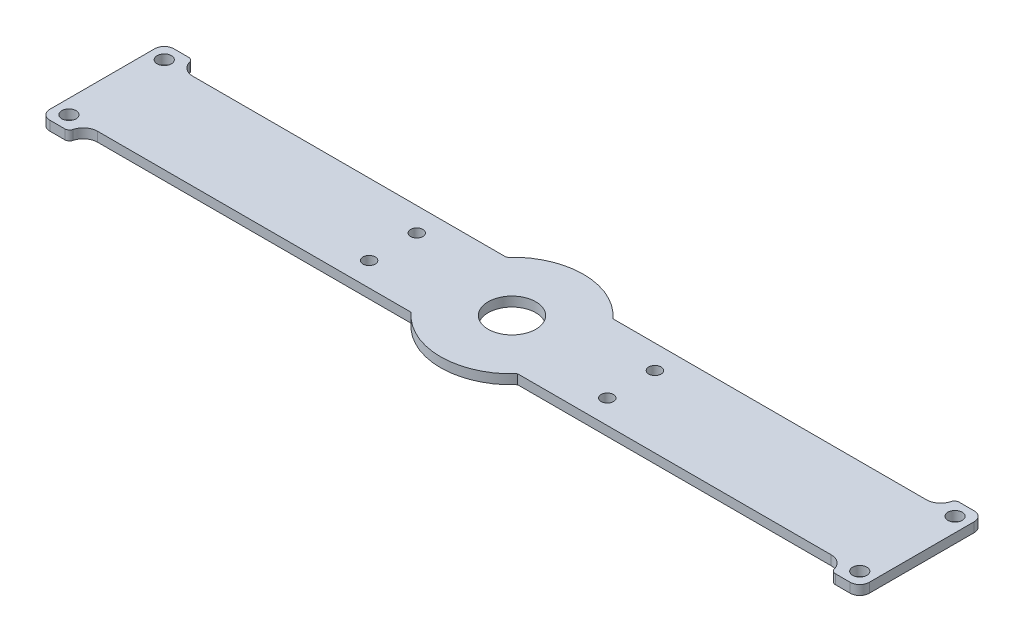
ISO-10303-21;
HEADER;
FILE_DESCRIPTION(('STEP AP214'),'2;1');
FILE_NAME('part.step','',(''),(''),'','','');
FILE_SCHEMA(('AUTOMOTIVE_DESIGN { 1 0 10303 214 1 1 1 1 }'));
ENDSEC;
DATA;
#1=APPLICATION_CONTEXT('core data for automotive mechanical design processes');
#2=APPLICATION_PROTOCOL_DEFINITION('international standard','automotive_design',2000,#1);
#3=PRODUCT_CONTEXT('',#1,'mechanical');
#4=PRODUCT('Part','Part','',(#3));
#5=PRODUCT_RELATED_PRODUCT_CATEGORY('part','',(#4));
#6=PRODUCT_DEFINITION_FORMATION('','',#4);
#7=PRODUCT_DEFINITION_CONTEXT('part definition',#1,'design');
#8=PRODUCT_DEFINITION('design','',#6,#7);
#9=PRODUCT_DEFINITION_SHAPE('','',#8);
#10=(LENGTH_UNIT() NAMED_UNIT(*) SI_UNIT(.MILLI.,.METRE.));
#11=(NAMED_UNIT(*) PLANE_ANGLE_UNIT() SI_UNIT($,.RADIAN.));
#12=(NAMED_UNIT(*) SI_UNIT($,.STERADIAN.) SOLID_ANGLE_UNIT());
#13=UNCERTAINTY_MEASURE_WITH_UNIT(LENGTH_MEASURE(1.E-05),#10,'distance_accuracy_value','');
#14=(GEOMETRIC_REPRESENTATION_CONTEXT(3) GLOBAL_UNCERTAINTY_ASSIGNED_CONTEXT((#13)) GLOBAL_UNIT_ASSIGNED_CONTEXT((#10,
#11,#12)) REPRESENTATION_CONTEXT('',''));
#15=CARTESIAN_POINT('',(0.,0.,0.));
#16=DIRECTION('',(0.,0.,1.));
#17=DIRECTION('',(1.,0.,0.));
#18=AXIS2_PLACEMENT_3D('',#15,#16,#17);
#19=CARTESIAN_POINT('',(0.,2.,0.));
#20=DIRECTION('',(0.,1.,0.));
#21=DIRECTION('',(0.,0.,1.));
#22=AXIS2_PLACEMENT_3D('',#19,#20,#21);
#23=PLANE('',#22);
#24=CARTESIAN_POINT('',(25.,2.,-5.));
#25=DIRECTION('',(0.,1.,0.));
#26=DIRECTION('',(0.,0.,-1.));
#27=AXIS2_PLACEMENT_3D('',#24,#25,#26);
#28=CIRCLE('',#27,1.3);
#29=CARTESIAN_POINT('',(25.,2.,-6.3));
#30=VERTEX_POINT('',#29);
#31=EDGE_CURVE('E460',#30,#30,#28,.T.);
#32=ORIENTED_EDGE('',*,*,#31,.F.);
#33=EDGE_LOOP('',(#32));
#34=FACE_BOUND('',#33,.T.);
#35=CARTESIAN_POINT('',(25.,2.,5.));
#36=DIRECTION('',(0.,1.,0.));
#37=DIRECTION('',(0.,0.,1.));
#38=AXIS2_PLACEMENT_3D('',#35,#36,#37);
#39=CIRCLE('',#38,1.3);
#40=CARTESIAN_POINT('',(25.,2.,6.29999999999999));
#41=VERTEX_POINT('',#40);
#42=EDGE_CURVE('E452',#41,#41,#39,.T.);
#43=ORIENTED_EDGE('',*,*,#42,.F.);
#44=EDGE_LOOP('',(#43));
#45=FACE_BOUND('',#44,.T.);
#46=CARTESIAN_POINT('',(-25.,2.,5.));
#47=DIRECTION('',(0.,1.,0.));
#48=DIRECTION('',(0.,0.,-1.));
#49=AXIS2_PLACEMENT_3D('',#46,#47,#48);
#50=CIRCLE('',#49,1.3);
#51=CARTESIAN_POINT('',(-25.,2.,3.7));
#52=VERTEX_POINT('',#51);
#53=EDGE_CURVE('E444',#52,#52,#50,.T.);
#54=ORIENTED_EDGE('',*,*,#53,.F.);
#55=EDGE_LOOP('',(#54));
#56=FACE_BOUND('',#55,.T.);
#57=CARTESIAN_POINT('',(-25.,2.,-5.));
#58=DIRECTION('',(0.,1.,0.));
#59=DIRECTION('',(0.,0.,1.));
#60=AXIS2_PLACEMENT_3D('',#57,#58,#59);
#61=CIRCLE('',#60,1.3);
#62=CARTESIAN_POINT('',(-25.,2.,-3.7));
#63=VERTEX_POINT('',#62);
#64=EDGE_CURVE('E443',#63,#63,#61,.T.);
#65=ORIENTED_EDGE('',*,*,#64,.F.);
#66=EDGE_LOOP('',(#65));
#67=FACE_BOUND('',#66,.T.);
#68=CARTESIAN_POINT('',(77.,2.,13.));
#69=DIRECTION('',(0.,1.,0.));
#70=DIRECTION('',(0.,0.,1.));
#71=AXIS2_PLACEMENT_3D('',#68,#69,#70);
#72=CIRCLE('',#71,3.);
#73=CARTESIAN_POINT('',(77.,2.,10.));
#74=VERTEX_POINT('',#73);
#75=CARTESIAN_POINT('',(79.9047375096555,2.,12.25));
#76=VERTEX_POINT('',#75);
#77=EDGE_CURVE('E287',#74,#76,#72,.F.);
#78=ORIENTED_EDGE('',*,*,#77,.T.);
#79=CARTESIAN_POINT('',(80.8729833462074,2.,12.));
#80=DIRECTION('',(0.,1.,0.));
#81=DIRECTION('',(0.,0.,1.));
#82=AXIS2_PLACEMENT_3D('',#79,#80,#81);
#83=CIRCLE('',#82,1.);
#84=CARTESIAN_POINT('',(80.8729833462074,2.,13.));
#85=VERTEX_POINT('',#84);
#86=EDGE_CURVE('E392',#76,#85,#83,.T.);
#87=ORIENTED_EDGE('',*,*,#86,.T.);
#88=DIRECTION('',(1.,0.,0.));
#89=VECTOR('',#88,1.);
#90=CARTESIAN_POINT('',(80.,2.,13.));
#91=LINE('',#90,#89);
#92=CARTESIAN_POINT('',(84.,2.,13.));
#93=VERTEX_POINT('',#92);
#94=EDGE_CURVE('E495',#85,#93,#91,.T.);
#95=ORIENTED_EDGE('',*,*,#94,.T.);
#96=CARTESIAN_POINT('',(84.,2.,11.));
#97=DIRECTION('',(0.,1.,0.));
#98=DIRECTION('',(0.,0.,1.));
#99=AXIS2_PLACEMENT_3D('',#96,#97,#98);
#100=CIRCLE('',#99,2.);
#101=CARTESIAN_POINT('',(86.,2.,11.));
#102=VERTEX_POINT('',#101);
#103=EDGE_CURVE('E337',#93,#102,#100,.T.);
#104=ORIENTED_EDGE('',*,*,#103,.T.);
#105=DIRECTION('',(0.,0.,-1.));
#106=VECTOR('',#105,1.);
#107=CARTESIAN_POINT('',(86.,2.,-13.));
#108=LINE('',#107,#106);
#109=CARTESIAN_POINT('',(86.,2.,-11.));
#110=VERTEX_POINT('',#109);
#111=EDGE_CURVE('E501',#102,#110,#108,.T.);
#112=ORIENTED_EDGE('',*,*,#111,.T.);
#113=CARTESIAN_POINT('',(84.,2.,-11.));
#114=DIRECTION('',(0.,1.,0.));
#115=DIRECTION('',(0.,0.,1.));
#116=AXIS2_PLACEMENT_3D('',#113,#114,#115);
#117=CIRCLE('',#116,2.);
#118=CARTESIAN_POINT('',(84.,2.,-13.));
#119=VERTEX_POINT('',#118);
#120=EDGE_CURVE('E334',#110,#119,#117,.T.);
#121=ORIENTED_EDGE('',*,*,#120,.T.);
#122=DIRECTION('',(-1.,0.,0.));
#123=VECTOR('',#122,1.);
#124=CARTESIAN_POINT('',(80.,2.,-13.));
#125=LINE('',#124,#123);
#126=CARTESIAN_POINT('',(80.8729833462074,2.,-13.));
#127=VERTEX_POINT('',#126);
#128=EDGE_CURVE('E507',#119,#127,#125,.T.);
#129=ORIENTED_EDGE('',*,*,#128,.T.);
#130=CARTESIAN_POINT('',(80.8729833462074,2.,-12.));
#131=DIRECTION('',(0.,1.,0.));
#132=DIRECTION('',(0.,0.,1.));
#133=AXIS2_PLACEMENT_3D('',#130,#131,#132);
#134=CIRCLE('',#133,1.);
#135=CARTESIAN_POINT('',(79.9047375096555,2.,-12.25));
#136=VERTEX_POINT('',#135);
#137=EDGE_CURVE('E61',#127,#136,#134,.T.);
#138=ORIENTED_EDGE('',*,*,#137,.T.);
#139=CARTESIAN_POINT('',(77.,2.,-13.));
#140=DIRECTION('',(0.,1.,0.));
#141=DIRECTION('',(0.,0.,1.));
#142=AXIS2_PLACEMENT_3D('',#139,#140,#141);
#143=CIRCLE('',#142,3.);
#144=CARTESIAN_POINT('',(77.,2.,-10.));
#145=VERTEX_POINT('',#144);
#146=EDGE_CURVE('E208',#136,#145,#143,.F.);
#147=ORIENTED_EDGE('',*,*,#146,.T.);
#148=DIRECTION('',(-1.,0.,0.));
#149=VECTOR('',#148,1.);
#150=CARTESIAN_POINT('',(11.1803398874989,2.,-10.));
#151=LINE('',#150,#149);
#152=CARTESIAN_POINT('',(11.1803398874989,2.,-10.));
#153=VERTEX_POINT('',#152);
#154=EDGE_CURVE('E200',#145,#153,#151,.T.);
#155=ORIENTED_EDGE('',*,*,#154,.T.);
#156=CARTESIAN_POINT('',(0.,2.,0.));
#157=DIRECTION('',(0.,1.,0.));
#158=DIRECTION('',(0.,0.,1.));
#159=AXIS2_PLACEMENT_3D('',#156,#157,#158);
#160=CIRCLE('',#159,15.);
#161=CARTESIAN_POINT('',(-11.180339887499,2.,-9.99999999999999));
#162=VERTEX_POINT('',#161);
#163=EDGE_CURVE('E206',#153,#162,#160,.T.);
#164=ORIENTED_EDGE('',*,*,#163,.T.);
#165=DIRECTION('',(-1.,0.,0.));
#166=VECTOR('',#165,1.);
#167=CARTESIAN_POINT('',(-80.,2.,-10.));
#168=LINE('',#167,#166);
#169=CARTESIAN_POINT('',(-77.,2.,-10.));
#170=VERTEX_POINT('',#169);
#171=EDGE_CURVE('E230',#162,#170,#168,.T.);
#172=ORIENTED_EDGE('',*,*,#171,.T.);
#173=CARTESIAN_POINT('',(-77.,2.,-13.));
#174=DIRECTION('',(0.,1.,0.));
#175=DIRECTION('',(0.,0.,1.));
#176=AXIS2_PLACEMENT_3D('',#173,#174,#175);
#177=CIRCLE('',#176,3.);
#178=CARTESIAN_POINT('',(-79.9047375096555,2.,-12.25));
#179=VERTEX_POINT('',#178);
#180=EDGE_CURVE('E299',#170,#179,#177,.F.);
#181=ORIENTED_EDGE('',*,*,#180,.T.);
#182=CARTESIAN_POINT('',(-80.8729833462074,2.,-12.));
#183=DIRECTION('',(0.,1.,0.));
#184=DIRECTION('',(0.,0.,1.));
#185=AXIS2_PLACEMENT_3D('',#182,#183,#184);
#186=CIRCLE('',#185,1.);
#187=CARTESIAN_POINT('',(-80.8729833462074,2.,-13.));
#188=VERTEX_POINT('',#187);
#189=EDGE_CURVE('E384',#179,#188,#186,.T.);
#190=ORIENTED_EDGE('',*,*,#189,.T.);
#191=DIRECTION('',(-1.,0.,0.));
#192=VECTOR('',#191,1.);
#193=CARTESIAN_POINT('',(-80.,2.,-13.));
#194=LINE('',#193,#192);
#195=CARTESIAN_POINT('',(-84.,2.,-13.));
#196=VERTEX_POINT('',#195);
#197=EDGE_CURVE('E416',#188,#196,#194,.T.);
#198=ORIENTED_EDGE('',*,*,#197,.T.);
#199=CARTESIAN_POINT('',(-84.,2.,-11.));
#200=DIRECTION('',(0.,1.,0.));
#201=DIRECTION('',(0.,0.,1.));
#202=AXIS2_PLACEMENT_3D('',#199,#200,#201);
#203=CIRCLE('',#202,2.);
#204=CARTESIAN_POINT('',(-86.,2.,-11.));
#205=VERTEX_POINT('',#204);
#206=EDGE_CURVE('E343',#196,#205,#203,.T.);
#207=ORIENTED_EDGE('',*,*,#206,.T.);
#208=DIRECTION('',(0.,0.,1.));
#209=VECTOR('',#208,1.);
#210=CARTESIAN_POINT('',(-86.,2.,-13.));
#211=LINE('',#210,#209);
#212=CARTESIAN_POINT('',(-86.,2.,11.));
#213=VERTEX_POINT('',#212);
#214=EDGE_CURVE('E464',#205,#213,#211,.T.);
#215=ORIENTED_EDGE('',*,*,#214,.T.);
#216=CARTESIAN_POINT('',(-84.,2.,11.));
#217=DIRECTION('',(0.,1.,0.));
#218=DIRECTION('',(0.,0.,1.));
#219=AXIS2_PLACEMENT_3D('',#216,#217,#218);
#220=CIRCLE('',#219,2.);
#221=CARTESIAN_POINT('',(-84.,2.,13.));
#222=VERTEX_POINT('',#221);
#223=EDGE_CURVE('E340',#213,#222,#220,.T.);
#224=ORIENTED_EDGE('',*,*,#223,.T.);
#225=DIRECTION('',(1.,0.,0.));
#226=VECTOR('',#225,1.);
#227=CARTESIAN_POINT('',(-80.,2.,13.));
#228=LINE('',#227,#226);
#229=CARTESIAN_POINT('',(-80.8729833462074,2.,13.));
#230=VERTEX_POINT('',#229);
#231=EDGE_CURVE('E432',#222,#230,#228,.T.);
#232=ORIENTED_EDGE('',*,*,#231,.T.);
#233=CARTESIAN_POINT('',(-80.8729833462074,2.,12.));
#234=DIRECTION('',(0.,1.,0.));
#235=DIRECTION('',(0.,0.,1.));
#236=AXIS2_PLACEMENT_3D('',#233,#234,#235);
#237=CIRCLE('',#236,1.);
#238=CARTESIAN_POINT('',(-79.9047375096555,2.,12.25));
#239=VERTEX_POINT('',#238);
#240=EDGE_CURVE('E387',#230,#239,#237,.T.);
#241=ORIENTED_EDGE('',*,*,#240,.T.);
#242=CARTESIAN_POINT('',(-77.,2.,13.));
#243=DIRECTION('',(0.,1.,0.));
#244=DIRECTION('',(0.,0.,1.));
#245=AXIS2_PLACEMENT_3D('',#242,#243,#244);
#246=CIRCLE('',#245,3.);
#247=CARTESIAN_POINT('',(-77.,2.,10.));
#248=VERTEX_POINT('',#247);
#249=EDGE_CURVE('E306',#239,#248,#246,.F.);
#250=ORIENTED_EDGE('',*,*,#249,.T.);
#251=DIRECTION('',(1.,0.,0.));
#252=VECTOR('',#251,1.);
#253=CARTESIAN_POINT('',(-80.,2.,10.));
#254=LINE('',#253,#252);
#255=CARTESIAN_POINT('',(-11.1803398874989,2.,10.));
#256=VERTEX_POINT('',#255);
#257=EDGE_CURVE('E233',#248,#256,#254,.T.);
#258=ORIENTED_EDGE('',*,*,#257,.T.);
#259=CARTESIAN_POINT('',(0.,2.,0.));
#260=DIRECTION('',(0.,1.,0.));
#261=DIRECTION('',(0.,0.,1.));
#262=AXIS2_PLACEMENT_3D('',#259,#260,#261);
#263=CIRCLE('',#262,15.);
#264=CARTESIAN_POINT('',(11.1803398874989,2.,10.));
#265=VERTEX_POINT('',#264);
#266=EDGE_CURVE('E239',#256,#265,#263,.T.);
#267=ORIENTED_EDGE('',*,*,#266,.T.);
#268=DIRECTION('',(1.,0.,0.));
#269=VECTOR('',#268,1.);
#270=CARTESIAN_POINT('',(11.1803398874989,2.,10.));
#271=LINE('',#270,#269);
#272=EDGE_CURVE('E213',#265,#74,#271,.T.);
#273=ORIENTED_EDGE('',*,*,#272,.T.);
#274=EDGE_LOOP('',(#78,#87,#95,#104,#112,#121,#129,#138,#147,#155,#164,#172,#181,#190,#198,#207,
#215,#224,#232,#241,#250,#258,#267,#273));
#275=FACE_BOUND('',#274,.T.);
#276=CARTESIAN_POINT('',(0.,2.,0.));
#277=DIRECTION('',(0.,1.,0.));
#278=DIRECTION('',(0.,0.,1.));
#279=AXIS2_PLACEMENT_3D('',#276,#277,#278);
#280=CIRCLE('',#279,5.);
#281=CARTESIAN_POINT('',(0.,2.,5.));
#282=VERTEX_POINT('',#281);
#283=EDGE_CURVE('E247',#282,#282,#280,.T.);
#284=ORIENTED_EDGE('',*,*,#283,.F.);
#285=EDGE_LOOP('',(#284));
#286=FACE_BOUND('',#285,.T.);
#287=CARTESIAN_POINT('',(-83.,2.,-10.));
#288=DIRECTION('',(0.,1.,0.));
#289=DIRECTION('',(0.,0.,1.));
#290=AXIS2_PLACEMENT_3D('',#287,#288,#289);
#291=CIRCLE('',#290,1.5);
#292=CARTESIAN_POINT('',(-83.,2.,-8.5));
#293=VERTEX_POINT('',#292);
#294=EDGE_CURVE('E435',#293,#293,#291,.T.);
#295=ORIENTED_EDGE('',*,*,#294,.F.);
#296=EDGE_LOOP('',(#295));
#297=FACE_BOUND('',#296,.T.);
#298=CARTESIAN_POINT('',(-83.,2.,10.));
#299=DIRECTION('',(0.,1.,0.));
#300=DIRECTION('',(0.,0.,-1.));
#301=AXIS2_PLACEMENT_3D('',#298,#299,#300);
#302=CIRCLE('',#301,1.5);
#303=CARTESIAN_POINT('',(-83.,2.,8.5));
#304=VERTEX_POINT('',#303);
#305=EDGE_CURVE('E526',#304,#304,#302,.T.);
#306=ORIENTED_EDGE('',*,*,#305,.F.);
#307=EDGE_LOOP('',(#306));
#308=FACE_BOUND('',#307,.T.);
#309=CARTESIAN_POINT('',(83.,2.,10.));
#310=DIRECTION('',(0.,1.,0.));
#311=DIRECTION('',(0.,0.,1.));
#312=AXIS2_PLACEMENT_3D('',#309,#310,#311);
#313=CIRCLE('',#312,1.5);
#314=CARTESIAN_POINT('',(83.,2.,11.5));
#315=VERTEX_POINT('',#314);
#316=EDGE_CURVE('E522',#315,#315,#313,.T.);
#317=ORIENTED_EDGE('',*,*,#316,.F.);
#318=EDGE_LOOP('',(#317));
#319=FACE_BOUND('',#318,.T.);
#320=CARTESIAN_POINT('',(83.,2.,-10.));
#321=DIRECTION('',(0.,1.,0.));
#322=DIRECTION('',(0.,0.,-1.));
#323=AXIS2_PLACEMENT_3D('',#320,#321,#322);
#324=CIRCLE('',#323,1.5);
#325=CARTESIAN_POINT('',(83.,2.,-11.5));
#326=VERTEX_POINT('',#325);
#327=EDGE_CURVE('E927',#326,#326,#324,.T.);
#328=ORIENTED_EDGE('',*,*,#327,.F.);
#329=EDGE_LOOP('',(#328));
#330=FACE_BOUND('',#329,.T.);
#331=ADVANCED_FACE('F39',(#34,#45,#56,#67,#275,#286,#297,#308,#319,#330),#23,.T.);
#332=CARTESIAN_POINT('',(0.,0.,0.));
#333=DIRECTION('',(0.,1.,0.));
#334=DIRECTION('',(0.,0.,1.));
#335=AXIS2_PLACEMENT_3D('',#332,#333,#334);
#336=PLANE('',#335);
#337=CARTESIAN_POINT('',(25.,0.,-5.));
#338=DIRECTION('',(0.,1.,0.));
#339=DIRECTION('',(0.,0.,-1.));
#340=AXIS2_PLACEMENT_3D('',#337,#338,#339);
#341=CIRCLE('',#340,1.3);
#342=CARTESIAN_POINT('',(25.,0.,-6.3));
#343=VERTEX_POINT('',#342);
#344=EDGE_CURVE('E456',#343,#343,#341,.T.);
#345=ORIENTED_EDGE('',*,*,#344,.T.);
#346=EDGE_LOOP('',(#345));
#347=FACE_BOUND('',#346,.T.);
#348=CARTESIAN_POINT('',(25.,0.,5.));
#349=DIRECTION('',(0.,1.,0.));
#350=DIRECTION('',(0.,0.,1.));
#351=AXIS2_PLACEMENT_3D('',#348,#349,#350);
#352=CIRCLE('',#351,1.3);
#353=CARTESIAN_POINT('',(25.,0.,6.29999999999999));
#354=VERTEX_POINT('',#353);
#355=EDGE_CURVE('E448',#354,#354,#352,.T.);
#356=ORIENTED_EDGE('',*,*,#355,.T.);
#357=EDGE_LOOP('',(#356));
#358=FACE_BOUND('',#357,.T.);
#359=CARTESIAN_POINT('',(-25.,0.,5.));
#360=DIRECTION('',(0.,1.,0.));
#361=DIRECTION('',(0.,0.,-1.));
#362=AXIS2_PLACEMENT_3D('',#359,#360,#361);
#363=CIRCLE('',#362,1.3);
#364=CARTESIAN_POINT('',(-25.,0.,3.7));
#365=VERTEX_POINT('',#364);
#366=EDGE_CURVE('E439',#365,#365,#363,.T.);
#367=ORIENTED_EDGE('',*,*,#366,.T.);
#368=EDGE_LOOP('',(#367));
#369=FACE_BOUND('',#368,.T.);
#370=CARTESIAN_POINT('',(-25.,0.,-5.));
#371=DIRECTION('',(0.,1.,0.));
#372=DIRECTION('',(0.,0.,1.));
#373=AXIS2_PLACEMENT_3D('',#370,#371,#372);
#374=CIRCLE('',#373,1.3);
#375=CARTESIAN_POINT('',(-25.,0.,-3.7));
#376=VERTEX_POINT('',#375);
#377=EDGE_CURVE('E465',#376,#376,#374,.T.);
#378=ORIENTED_EDGE('',*,*,#377,.T.);
#379=EDGE_LOOP('',(#378));
#380=FACE_BOUND('',#379,.T.);
#381=DIRECTION('',(1.,0.,0.));
#382=VECTOR('',#381,1.);
#383=CARTESIAN_POINT('',(80.,0.,13.));
#384=LINE('',#383,#382);
#385=CARTESIAN_POINT('',(80.8729833462074,0.,13.));
#386=VERTEX_POINT('',#385);
#387=CARTESIAN_POINT('',(84.,0.,13.));
#388=VERTEX_POINT('',#387);
#389=EDGE_CURVE('E519',#386,#388,#384,.T.);
#390=ORIENTED_EDGE('',*,*,#389,.F.);
#391=CARTESIAN_POINT('',(80.8729833462074,0.,12.));
#392=DIRECTION('',(0.,1.,0.));
#393=DIRECTION('',(0.,0.,1.));
#394=AXIS2_PLACEMENT_3D('',#391,#392,#393);
#395=CIRCLE('',#394,1.);
#396=CARTESIAN_POINT('',(79.9047375096555,0.,12.25));
#397=VERTEX_POINT('',#396);
#398=EDGE_CURVE('E378',#386,#397,#395,.F.);
#399=ORIENTED_EDGE('',*,*,#398,.T.);
#400=CARTESIAN_POINT('',(77.,0.,13.));
#401=DIRECTION('',(0.,1.,0.));
#402=DIRECTION('',(0.,0.,1.));
#403=AXIS2_PLACEMENT_3D('',#400,#401,#402);
#404=CIRCLE('',#403,3.);
#405=CARTESIAN_POINT('',(77.,0.,10.));
#406=VERTEX_POINT('',#405);
#407=EDGE_CURVE('E284',#397,#406,#404,.T.);
#408=ORIENTED_EDGE('',*,*,#407,.T.);
#409=DIRECTION('',(1.,0.,0.));
#410=VECTOR('',#409,1.);
#411=CARTESIAN_POINT('',(11.1803398874989,0.,10.));
#412=LINE('',#411,#410);
#413=CARTESIAN_POINT('',(11.1803398874989,0.,10.));
#414=VERTEX_POINT('',#413);
#415=EDGE_CURVE('E243',#414,#406,#412,.T.);
#416=ORIENTED_EDGE('',*,*,#415,.F.);
#417=CARTESIAN_POINT('',(0.,0.,0.));
#418=DIRECTION('',(0.,1.,0.));
#419=DIRECTION('',(0.,0.,1.));
#420=AXIS2_PLACEMENT_3D('',#417,#418,#419);
#421=CIRCLE('',#420,15.);
#422=CARTESIAN_POINT('',(-11.1803398874989,0.,10.));
#423=VERTEX_POINT('',#422);
#424=EDGE_CURVE('E260',#423,#414,#421,.T.);
#425=ORIENTED_EDGE('',*,*,#424,.F.);
#426=DIRECTION('',(1.,0.,0.));
#427=VECTOR('',#426,1.);
#428=CARTESIAN_POINT('',(-80.,0.,10.));
#429=LINE('',#428,#427);
#430=CARTESIAN_POINT('',(-77.,0.,10.));
#431=VERTEX_POINT('',#430);
#432=EDGE_CURVE('E257',#431,#423,#429,.T.);
#433=ORIENTED_EDGE('',*,*,#432,.F.);
#434=CARTESIAN_POINT('',(-77.,0.,13.));
#435=DIRECTION('',(0.,1.,0.));
#436=DIRECTION('',(0.,0.,1.));
#437=AXIS2_PLACEMENT_3D('',#434,#435,#436);
#438=CIRCLE('',#437,3.);
#439=CARTESIAN_POINT('',(-79.9047375096555,0.,12.25));
#440=VERTEX_POINT('',#439);
#441=EDGE_CURVE('E302',#431,#440,#438,.T.);
#442=ORIENTED_EDGE('',*,*,#441,.T.);
#443=CARTESIAN_POINT('',(-80.8729833462074,0.,12.));
#444=DIRECTION('',(0.,1.,0.));
#445=DIRECTION('',(0.,0.,1.));
#446=AXIS2_PLACEMENT_3D('',#443,#444,#445);
#447=CIRCLE('',#446,1.);
#448=CARTESIAN_POINT('',(-80.8729833462074,0.,13.));
#449=VERTEX_POINT('',#448);
#450=EDGE_CURVE('E372',#440,#449,#447,.F.);
#451=ORIENTED_EDGE('',*,*,#450,.T.);
#452=DIRECTION('',(1.,0.,0.));
#453=VECTOR('',#452,1.);
#454=CARTESIAN_POINT('',(-80.,0.,13.));
#455=LINE('',#454,#453);
#456=CARTESIAN_POINT('',(-84.,0.,13.));
#457=VERTEX_POINT('',#456);
#458=EDGE_CURVE('E427',#457,#449,#455,.T.);
#459=ORIENTED_EDGE('',*,*,#458,.F.);
#460=CARTESIAN_POINT('',(-84.,0.,11.));
#461=DIRECTION('',(0.,1.,0.));
#462=DIRECTION('',(0.,0.,1.));
#463=AXIS2_PLACEMENT_3D('',#460,#461,#462);
#464=CIRCLE('',#463,2.);
#465=CARTESIAN_POINT('',(-86.,0.,11.));
#466=VERTEX_POINT('',#465);
#467=EDGE_CURVE('E323',#457,#466,#464,.F.);
#468=ORIENTED_EDGE('',*,*,#467,.T.);
#469=DIRECTION('',(0.,0.,1.));
#470=VECTOR('',#469,1.);
#471=CARTESIAN_POINT('',(-86.,0.,-13.));
#472=LINE('',#471,#470);
#473=CARTESIAN_POINT('',(-86.,0.,-11.));
#474=VERTEX_POINT('',#473);
#475=EDGE_CURVE('E426',#474,#466,#472,.T.);
#476=ORIENTED_EDGE('',*,*,#475,.F.);
#477=CARTESIAN_POINT('',(-84.,0.,-11.));
#478=DIRECTION('',(0.,1.,0.));
#479=DIRECTION('',(0.,0.,1.));
#480=AXIS2_PLACEMENT_3D('',#477,#478,#479);
#481=CIRCLE('',#480,2.);
#482=CARTESIAN_POINT('',(-84.,0.,-13.));
#483=VERTEX_POINT('',#482);
#484=EDGE_CURVE('E326',#474,#483,#481,.F.);
#485=ORIENTED_EDGE('',*,*,#484,.T.);
#486=DIRECTION('',(-1.,0.,0.));
#487=VECTOR('',#486,1.);
#488=CARTESIAN_POINT('',(-80.,0.,-13.));
#489=LINE('',#488,#487);
#490=CARTESIAN_POINT('',(-80.8729833462074,0.,-13.));
#491=VERTEX_POINT('',#490);
#492=EDGE_CURVE('E415',#491,#483,#489,.T.);
#493=ORIENTED_EDGE('',*,*,#492,.F.);
#494=CARTESIAN_POINT('',(-80.8729833462074,0.,-12.));
#495=DIRECTION('',(0.,1.,0.));
#496=DIRECTION('',(0.,0.,1.));
#497=AXIS2_PLACEMENT_3D('',#494,#495,#496);
#498=CIRCLE('',#497,1.);
#499=CARTESIAN_POINT('',(-79.9047375096555,0.,-12.25));
#500=VERTEX_POINT('',#499);
#501=EDGE_CURVE('E369',#491,#500,#498,.F.);
#502=ORIENTED_EDGE('',*,*,#501,.T.);
#503=CARTESIAN_POINT('',(-77.,0.,-13.));
#504=DIRECTION('',(0.,1.,0.));
#505=DIRECTION('',(0.,0.,1.));
#506=AXIS2_PLACEMENT_3D('',#503,#504,#505);
#507=CIRCLE('',#506,3.);
#508=CARTESIAN_POINT('',(-77.,0.,-10.));
#509=VERTEX_POINT('',#508);
#510=EDGE_CURVE('E296',#500,#509,#507,.T.);
#511=ORIENTED_EDGE('',*,*,#510,.T.);
#512=DIRECTION('',(-1.,0.,0.));
#513=VECTOR('',#512,1.);
#514=CARTESIAN_POINT('',(-80.,0.,-10.));
#515=LINE('',#514,#513);
#516=CARTESIAN_POINT('',(-11.180339887499,0.,-9.99999999999999));
#517=VERTEX_POINT('',#516);
#518=EDGE_CURVE('E253',#517,#509,#515,.T.);
#519=ORIENTED_EDGE('',*,*,#518,.F.);
#520=CARTESIAN_POINT('',(0.,0.,0.));
#521=DIRECTION('',(0.,1.,0.));
#522=DIRECTION('',(0.,0.,1.));
#523=AXIS2_PLACEMENT_3D('',#520,#521,#522);
#524=CIRCLE('',#523,15.);
#525=CARTESIAN_POINT('',(11.1803398874989,0.,-10.));
#526=VERTEX_POINT('',#525);
#527=EDGE_CURVE('E250',#526,#517,#524,.T.);
#528=ORIENTED_EDGE('',*,*,#527,.F.);
#529=DIRECTION('',(-1.,0.,0.));
#530=VECTOR('',#529,1.);
#531=CARTESIAN_POINT('',(11.1803398874989,0.,-10.));
#532=LINE('',#531,#530);
#533=CARTESIAN_POINT('',(77.,0.,-10.));
#534=VERTEX_POINT('',#533);
#535=EDGE_CURVE('E219',#534,#526,#532,.T.);
#536=ORIENTED_EDGE('',*,*,#535,.F.);
#537=CARTESIAN_POINT('',(77.,0.,-13.));
#538=DIRECTION('',(0.,1.,0.));
#539=DIRECTION('',(0.,0.,1.));
#540=AXIS2_PLACEMENT_3D('',#537,#538,#539);
#541=CIRCLE('',#540,3.);
#542=CARTESIAN_POINT('',(79.9047375096555,0.,-12.25));
#543=VERTEX_POINT('',#542);
#544=EDGE_CURVE('E290',#534,#543,#541,.T.);
#545=ORIENTED_EDGE('',*,*,#544,.T.);
#546=CARTESIAN_POINT('',(80.8729833462074,0.,-12.));
#547=DIRECTION('',(0.,1.,0.));
#548=DIRECTION('',(0.,0.,1.));
#549=AXIS2_PLACEMENT_3D('',#546,#547,#548);
#550=CIRCLE('',#549,1.);
#551=CARTESIAN_POINT('',(80.8729833462074,0.,-13.));
#552=VERTEX_POINT('',#551);
#553=EDGE_CURVE('E375',#543,#552,#550,.F.);
#554=ORIENTED_EDGE('',*,*,#553,.T.);
#555=DIRECTION('',(-1.,0.,0.));
#556=VECTOR('',#555,1.);
#557=CARTESIAN_POINT('',(80.,0.,-13.));
#558=LINE('',#557,#556);
#559=CARTESIAN_POINT('',(84.,0.,-13.));
#560=VERTEX_POINT('',#559);
#561=EDGE_CURVE('E502',#560,#552,#558,.T.);
#562=ORIENTED_EDGE('',*,*,#561,.F.);
#563=CARTESIAN_POINT('',(84.,0.,-11.));
#564=DIRECTION('',(0.,1.,0.));
#565=DIRECTION('',(0.,0.,1.));
#566=AXIS2_PLACEMENT_3D('',#563,#564,#565);
#567=CIRCLE('',#566,2.);
#568=CARTESIAN_POINT('',(86.,0.,-11.));
#569=VERTEX_POINT('',#568);
#570=EDGE_CURVE('E316',#560,#569,#567,.F.);
#571=ORIENTED_EDGE('',*,*,#570,.T.);
#572=DIRECTION('',(0.,0.,-1.));
#573=VECTOR('',#572,1.);
#574=CARTESIAN_POINT('',(86.,0.,-13.));
#575=LINE('',#574,#573);
#576=CARTESIAN_POINT('',(86.,0.,11.));
#577=VERTEX_POINT('',#576);
#578=EDGE_CURVE('E510',#577,#569,#575,.T.);
#579=ORIENTED_EDGE('',*,*,#578,.F.);
#580=CARTESIAN_POINT('',(84.,0.,11.));
#581=DIRECTION('',(0.,1.,0.));
#582=DIRECTION('',(0.,0.,1.));
#583=AXIS2_PLACEMENT_3D('',#580,#581,#582);
#584=CIRCLE('',#583,2.);
#585=EDGE_CURVE('E319',#577,#388,#584,.F.);
#586=ORIENTED_EDGE('',*,*,#585,.T.);
#587=EDGE_LOOP('',(#390,#399,#408,#416,#425,#433,#442,#451,#459,#468,#476,#485,#493,#502,#511,
#519,#528,#536,#545,#554,#562,#571,#579,#586));
#588=FACE_BOUND('',#587,.T.);
#589=CARTESIAN_POINT('',(0.,0.,0.));
#590=DIRECTION('',(0.,1.,0.));
#591=DIRECTION('',(0.,0.,1.));
#592=AXIS2_PLACEMENT_3D('',#589,#590,#591);
#593=CIRCLE('',#592,5.);
#594=CARTESIAN_POINT('',(0.,0.,5.));
#595=VERTEX_POINT('',#594);
#596=EDGE_CURVE('E469',#595,#595,#593,.T.);
#597=ORIENTED_EDGE('',*,*,#596,.T.);
#598=EDGE_LOOP('',(#597));
#599=FACE_BOUND('',#598,.T.);
#600=CARTESIAN_POINT('',(-83.,0.,-10.));
#601=DIRECTION('',(0.,1.,0.));
#602=DIRECTION('',(0.,0.,1.));
#603=AXIS2_PLACEMENT_3D('',#600,#601,#602);
#604=CIRCLE('',#603,1.5);
#605=CARTESIAN_POINT('',(-83.,0.,-8.5));
#606=VERTEX_POINT('',#605);
#607=EDGE_CURVE('E530',#606,#606,#604,.T.);
#608=ORIENTED_EDGE('',*,*,#607,.T.);
#609=EDGE_LOOP('',(#608));
#610=FACE_BOUND('',#609,.T.);
#611=CARTESIAN_POINT('',(-83.,0.,10.));
#612=DIRECTION('',(0.,1.,0.));
#613=DIRECTION('',(0.,0.,-1.));
#614=AXIS2_PLACEMENT_3D('',#611,#612,#613);
#615=CIRCLE('',#614,1.5);
#616=CARTESIAN_POINT('',(-83.,0.,8.5));
#617=VERTEX_POINT('',#616);
#618=EDGE_CURVE('E518',#617,#617,#615,.T.);
#619=ORIENTED_EDGE('',*,*,#618,.T.);
#620=EDGE_LOOP('',(#619));
#621=FACE_BOUND('',#620,.T.);
#622=CARTESIAN_POINT('',(83.,0.,10.));
#623=DIRECTION('',(0.,1.,0.));
#624=DIRECTION('',(0.,0.,1.));
#625=AXIS2_PLACEMENT_3D('',#622,#623,#624);
#626=CIRCLE('',#625,1.5);
#627=CARTESIAN_POINT('',(83.,0.,11.5));
#628=VERTEX_POINT('',#627);
#629=EDGE_CURVE('E513',#628,#628,#626,.T.);
#630=ORIENTED_EDGE('',*,*,#629,.T.);
#631=EDGE_LOOP('',(#630));
#632=FACE_BOUND('',#631,.T.);
#633=CARTESIAN_POINT('',(83.,0.,-10.));
#634=DIRECTION('',(0.,1.,0.));
#635=DIRECTION('',(0.,0.,-1.));
#636=AXIS2_PLACEMENT_3D('',#633,#634,#635);
#637=CIRCLE('',#636,1.5);
#638=CARTESIAN_POINT('',(83.,0.,-11.5));
#639=VERTEX_POINT('',#638);
#640=EDGE_CURVE('E924',#639,#639,#637,.T.);
#641=ORIENTED_EDGE('',*,*,#640,.T.);
#642=EDGE_LOOP('',(#641));
#643=FACE_BOUND('',#642,.T.);
#644=ADVANCED_FACE('F421',(#347,#358,#369,#380,#588,#599,#610,#621,#632,#643),#336,.F.);
#645=CARTESIAN_POINT('',(11.1803398874989,2.,10.));
#646=DIRECTION('',(0.,0.,-1.));
#647=DIRECTION('',(-1.,0.,0.));
#648=AXIS2_PLACEMENT_3D('',#645,#646,#647);
#649=PLANE('',#648);
#650=ORIENTED_EDGE('',*,*,#415,.T.);
#651=DIRECTION('',(0.,-1.,0.));
#652=VECTOR('',#651,1.);
#653=CARTESIAN_POINT('',(77.,2.,10.));
#654=LINE('',#653,#652);
#655=EDGE_CURVE('E223',#406,#74,#654,.F.);
#656=ORIENTED_EDGE('',*,*,#655,.T.);
#657=ORIENTED_EDGE('',*,*,#272,.F.);
#658=DIRECTION('',(0.,-1.,0.));
#659=VECTOR('',#658,1.);
#660=CARTESIAN_POINT('',(11.1803398874989,2.,10.));
#661=LINE('',#660,#659);
#662=EDGE_CURVE('E242',#265,#414,#661,.T.);
#663=ORIENTED_EDGE('',*,*,#662,.T.);
#664=EDGE_LOOP('',(#650,#656,#657,#663));
#665=FACE_BOUND('',#664,.T.);
#666=ADVANCED_FACE('F577',(#665),#649,.F.);
#667=CARTESIAN_POINT('',(11.1803398874989,2.,-10.));
#668=DIRECTION('',(0.,0.,1.));
#669=DIRECTION('',(1.,0.,0.));
#670=AXIS2_PLACEMENT_3D('',#667,#668,#669);
#671=PLANE('',#670);
#672=ORIENTED_EDGE('',*,*,#154,.F.);
#673=DIRECTION('',(0.,-1.,0.));
#674=VECTOR('',#673,1.);
#675=CARTESIAN_POINT('',(77.,0.,-10.));
#676=LINE('',#675,#674);
#677=EDGE_CURVE('E274',#145,#534,#676,.T.);
#678=ORIENTED_EDGE('',*,*,#677,.T.);
#679=ORIENTED_EDGE('',*,*,#535,.T.);
#680=DIRECTION('',(0.,-1.,0.));
#681=VECTOR('',#680,1.);
#682=CARTESIAN_POINT('',(11.1803398874989,2.,-10.));
#683=LINE('',#682,#681);
#684=EDGE_CURVE('E216',#153,#526,#683,.T.);
#685=ORIENTED_EDGE('',*,*,#684,.F.);
#686=EDGE_LOOP('',(#672,#678,#679,#685));
#687=FACE_BOUND('',#686,.T.);
#688=ADVANCED_FACE('F217',(#687),#671,.F.);
#689=CARTESIAN_POINT('',(0.,2.,0.));
#690=DIRECTION('',(0.,-1.,0.));
#691=DIRECTION('',(0.,0.,-1.));
#692=AXIS2_PLACEMENT_3D('',#689,#690,#691);
#693=CYLINDRICAL_SURFACE('',#692,15.);
#694=ORIENTED_EDGE('',*,*,#527,.T.);
#695=DIRECTION('',(0.,-1.,0.));
#696=VECTOR('',#695,1.);
#697=CARTESIAN_POINT('',(-11.180339887499,2.,-9.99999999999999));
#698=LINE('',#697,#696);
#699=EDGE_CURVE('E224',#162,#517,#698,.T.);
#700=ORIENTED_EDGE('',*,*,#699,.F.);
#701=ORIENTED_EDGE('',*,*,#163,.F.);
#702=ORIENTED_EDGE('',*,*,#684,.T.);
#703=EDGE_LOOP('',(#694,#700,#701,#702));
#704=FACE_BOUND('',#703,.T.);
#705=ADVANCED_FACE('F226',(#704),#693,.T.);
#706=CARTESIAN_POINT('',(-80.,2.,-10.));
#707=DIRECTION('',(0.,0.,1.));
#708=DIRECTION('',(1.,0.,0.));
#709=AXIS2_PLACEMENT_3D('',#706,#707,#708);
#710=PLANE('',#709);
#711=ORIENTED_EDGE('',*,*,#518,.T.);
#712=DIRECTION('',(0.,-1.,0.));
#713=VECTOR('',#712,1.);
#714=CARTESIAN_POINT('',(-77.,2.,-10.));
#715=LINE('',#714,#713);
#716=EDGE_CURVE('E277',#509,#170,#715,.F.);
#717=ORIENTED_EDGE('',*,*,#716,.T.);
#718=ORIENTED_EDGE('',*,*,#171,.F.);
#719=ORIENTED_EDGE('',*,*,#699,.T.);
#720=EDGE_LOOP('',(#711,#717,#718,#719));
#721=FACE_BOUND('',#720,.T.);
#722=ADVANCED_FACE('F602',(#721),#710,.F.);
#723=CARTESIAN_POINT('',(-80.,2.,10.));
#724=DIRECTION('',(0.,0.,-1.));
#725=DIRECTION('',(-1.,0.,0.));
#726=AXIS2_PLACEMENT_3D('',#723,#724,#725);
#727=PLANE('',#726);
#728=ORIENTED_EDGE('',*,*,#257,.F.);
#729=DIRECTION('',(0.,-1.,0.));
#730=VECTOR('',#729,1.);
#731=CARTESIAN_POINT('',(-77.,0.,10.));
#732=LINE('',#731,#730);
#733=EDGE_CURVE('E280',#248,#431,#732,.T.);
#734=ORIENTED_EDGE('',*,*,#733,.T.);
#735=ORIENTED_EDGE('',*,*,#432,.T.);
#736=DIRECTION('',(0.,-1.,0.));
#737=VECTOR('',#736,1.);
#738=CARTESIAN_POINT('',(-11.1803398874989,2.,10.));
#739=LINE('',#738,#737);
#740=EDGE_CURVE('E266',#256,#423,#739,.T.);
#741=ORIENTED_EDGE('',*,*,#740,.F.);
#742=EDGE_LOOP('',(#728,#734,#735,#741));
#743=FACE_BOUND('',#742,.T.);
#744=ADVANCED_FACE('F572',(#743),#727,.F.);
#745=CARTESIAN_POINT('',(0.,2.,0.));
#746=DIRECTION('',(0.,-1.,0.));
#747=DIRECTION('',(0.,0.,-1.));
#748=AXIS2_PLACEMENT_3D('',#745,#746,#747);
#749=CYLINDRICAL_SURFACE('',#748,15.);
#750=ORIENTED_EDGE('',*,*,#424,.T.);
#751=ORIENTED_EDGE('',*,*,#662,.F.);
#752=ORIENTED_EDGE('',*,*,#266,.F.);
#753=ORIENTED_EDGE('',*,*,#740,.T.);
#754=EDGE_LOOP('',(#750,#751,#752,#753));
#755=FACE_BOUND('',#754,.T.);
#756=ADVANCED_FACE('F575',(#755),#749,.T.);
#757=CARTESIAN_POINT('',(0.,2.,0.));
#758=DIRECTION('',(0.,-1.,0.));
#759=DIRECTION('',(0.,0.,-1.));
#760=AXIS2_PLACEMENT_3D('',#757,#758,#759);
#761=CYLINDRICAL_SURFACE('',#760,5.);
#762=ORIENTED_EDGE('',*,*,#283,.T.);
#763=EDGE_LOOP('',(#762));
#764=FACE_BOUND('',#763,.T.);
#765=ORIENTED_EDGE('',*,*,#596,.F.);
#766=EDGE_LOOP('',(#765));
#767=FACE_BOUND('',#766,.T.);
#768=ADVANCED_FACE('F630',(#764,#767),#761,.F.);
#769=CARTESIAN_POINT('',(-25.,0.,-5.));
#770=DIRECTION('',(0.,1.,0.));
#771=DIRECTION('',(0.,0.,1.));
#772=AXIS2_PLACEMENT_3D('',#769,#770,#771);
#773=CYLINDRICAL_SURFACE('',#772,1.3);
#774=ORIENTED_EDGE('',*,*,#377,.F.);
#775=EDGE_LOOP('',(#774));
#776=FACE_BOUND('',#775,.T.);
#777=ORIENTED_EDGE('',*,*,#64,.T.);
#778=EDGE_LOOP('',(#777));
#779=FACE_BOUND('',#778,.T.);
#780=ADVANCED_FACE('F880',(#776,#779),#773,.F.);
#781=CARTESIAN_POINT('',(-25.,0.,5.));
#782=DIRECTION('',(0.,1.,0.));
#783=DIRECTION('',(0.,0.,1.));
#784=AXIS2_PLACEMENT_3D('',#781,#782,#783);
#785=CYLINDRICAL_SURFACE('',#784,1.3);
#786=ORIENTED_EDGE('',*,*,#366,.F.);
#787=EDGE_LOOP('',(#786));
#788=FACE_BOUND('',#787,.T.);
#789=ORIENTED_EDGE('',*,*,#53,.T.);
#790=EDGE_LOOP('',(#789));
#791=FACE_BOUND('',#790,.T.);
#792=ADVANCED_FACE('F870',(#788,#791),#785,.F.);
#793=CARTESIAN_POINT('',(25.,0.,5.));
#794=DIRECTION('',(0.,1.,0.));
#795=DIRECTION('',(0.,0.,1.));
#796=AXIS2_PLACEMENT_3D('',#793,#794,#795);
#797=CYLINDRICAL_SURFACE('',#796,1.3);
#798=ORIENTED_EDGE('',*,*,#355,.F.);
#799=EDGE_LOOP('',(#798));
#800=FACE_BOUND('',#799,.T.);
#801=ORIENTED_EDGE('',*,*,#42,.T.);
#802=EDGE_LOOP('',(#801));
#803=FACE_BOUND('',#802,.T.);
#804=ADVANCED_FACE('F860',(#800,#803),#797,.F.);
#805=CARTESIAN_POINT('',(25.,0.,-5.));
#806=DIRECTION('',(0.,1.,0.));
#807=DIRECTION('',(0.,0.,1.));
#808=AXIS2_PLACEMENT_3D('',#805,#806,#807);
#809=CYLINDRICAL_SURFACE('',#808,1.3);
#810=ORIENTED_EDGE('',*,*,#344,.F.);
#811=EDGE_LOOP('',(#810));
#812=FACE_BOUND('',#811,.T.);
#813=ORIENTED_EDGE('',*,*,#31,.T.);
#814=EDGE_LOOP('',(#813));
#815=FACE_BOUND('',#814,.T.);
#816=ADVANCED_FACE('F754',(#812,#815),#809,.F.);
#817=CARTESIAN_POINT('',(-80.,2.,13.));
#818=DIRECTION('',(0.,0.,-1.));
#819=DIRECTION('',(-1.,0.,0.));
#820=AXIS2_PLACEMENT_3D('',#817,#818,#819);
#821=PLANE('',#820);
#822=ORIENTED_EDGE('',*,*,#458,.T.);
#823=DIRECTION('',(0.,1.,0.));
#824=VECTOR('',#823,1.);
#825=CARTESIAN_POINT('',(-80.8729833462074,2.,13.));
#826=LINE('',#825,#824);
#827=EDGE_CURVE('E406',#449,#230,#826,.T.);
#828=ORIENTED_EDGE('',*,*,#827,.T.);
#829=ORIENTED_EDGE('',*,*,#231,.F.);
#830=DIRECTION('',(0.,-1.,0.));
#831=VECTOR('',#830,1.);
#832=CARTESIAN_POINT('',(-84.,2.,13.));
#833=LINE('',#832,#831);
#834=EDGE_CURVE('E346',#222,#457,#833,.T.);
#835=ORIENTED_EDGE('',*,*,#834,.T.);
#836=EDGE_LOOP('',(#822,#828,#829,#835));
#837=FACE_BOUND('',#836,.T.);
#838=ADVANCED_FACE('F558',(#837),#821,.F.);
#839=CARTESIAN_POINT('',(-80.,2.,-13.));
#840=DIRECTION('',(0.,0.,1.));
#841=DIRECTION('',(1.,0.,0.));
#842=AXIS2_PLACEMENT_3D('',#839,#840,#841);
#843=PLANE('',#842);
#844=ORIENTED_EDGE('',*,*,#197,.F.);
#845=DIRECTION('',(0.,1.,0.));
#846=VECTOR('',#845,1.);
#847=CARTESIAN_POINT('',(-80.8729833462074,2.,-13.));
#848=LINE('',#847,#846);
#849=EDGE_CURVE('E48',#188,#491,#848,.F.);
#850=ORIENTED_EDGE('',*,*,#849,.T.);
#851=ORIENTED_EDGE('',*,*,#492,.T.);
#852=DIRECTION('',(0.,-1.,0.));
#853=VECTOR('',#852,1.);
#854=CARTESIAN_POINT('',(-84.,2.,-13.));
#855=LINE('',#854,#853);
#856=EDGE_CURVE('E330',#483,#196,#855,.F.);
#857=ORIENTED_EDGE('',*,*,#856,.T.);
#858=EDGE_LOOP('',(#844,#850,#851,#857));
#859=FACE_BOUND('',#858,.T.);
#860=ADVANCED_FACE('F414',(#859),#843,.F.);
#861=CARTESIAN_POINT('',(-86.,2.,-13.));
#862=DIRECTION('',(1.,0.,0.));
#863=DIRECTION('',(0.,0.,-1.));
#864=AXIS2_PLACEMENT_3D('',#861,#862,#863);
#865=PLANE('',#864);
#866=ORIENTED_EDGE('',*,*,#214,.F.);
#867=DIRECTION('',(0.,-1.,0.));
#868=VECTOR('',#867,1.);
#869=CARTESIAN_POINT('',(-86.,2.,-11.));
#870=LINE('',#869,#868);
#871=EDGE_CURVE('E312',#205,#474,#870,.T.);
#872=ORIENTED_EDGE('',*,*,#871,.T.);
#873=ORIENTED_EDGE('',*,*,#475,.T.);
#874=DIRECTION('',(0.,-1.,0.));
#875=VECTOR('',#874,1.);
#876=CARTESIAN_POINT('',(-86.,2.,11.));
#877=LINE('',#876,#875);
#878=EDGE_CURVE('E309',#466,#213,#877,.F.);
#879=ORIENTED_EDGE('',*,*,#878,.T.);
#880=EDGE_LOOP('',(#866,#872,#873,#879));
#881=FACE_BOUND('',#880,.T.);
#882=ADVANCED_FACE('F607',(#881),#865,.F.);
#883=CARTESIAN_POINT('',(-83.,2.,-10.));
#884=DIRECTION('',(0.,-1.,0.));
#885=DIRECTION('',(0.,0.,-1.));
#886=AXIS2_PLACEMENT_3D('',#883,#884,#885);
#887=CYLINDRICAL_SURFACE('',#886,1.5);
#888=ORIENTED_EDGE('',*,*,#294,.T.);
#889=EDGE_LOOP('',(#888));
#890=FACE_BOUND('',#889,.T.);
#891=ORIENTED_EDGE('',*,*,#607,.F.);
#892=EDGE_LOOP('',(#891));
#893=FACE_BOUND('',#892,.T.);
#894=ADVANCED_FACE('F609',(#890,#893),#887,.F.);
#895=CARTESIAN_POINT('',(-83.,2.,10.));
#896=DIRECTION('',(0.,-1.,0.));
#897=DIRECTION('',(0.,0.,-1.));
#898=AXIS2_PLACEMENT_3D('',#895,#896,#897);
#899=CYLINDRICAL_SURFACE('',#898,1.5);
#900=ORIENTED_EDGE('',*,*,#305,.T.);
#901=EDGE_LOOP('',(#900));
#902=FACE_BOUND('',#901,.T.);
#903=ORIENTED_EDGE('',*,*,#618,.F.);
#904=EDGE_LOOP('',(#903));
#905=FACE_BOUND('',#904,.T.);
#906=ADVANCED_FACE('F615',(#902,#905),#899,.F.);
#907=CARTESIAN_POINT('',(80.,2.,13.));
#908=DIRECTION('',(0.,0.,-1.));
#909=DIRECTION('',(-1.,0.,0.));
#910=AXIS2_PLACEMENT_3D('',#907,#908,#909);
#911=PLANE('',#910);
#912=ORIENTED_EDGE('',*,*,#94,.F.);
#913=DIRECTION('',(0.,1.,0.));
#914=VECTOR('',#913,1.);
#915=CARTESIAN_POINT('',(80.8729833462074,2.,13.));
#916=LINE('',#915,#914);
#917=EDGE_CURVE('E365',#85,#386,#916,.F.);
#918=ORIENTED_EDGE('',*,*,#917,.T.);
#919=ORIENTED_EDGE('',*,*,#389,.T.);
#920=DIRECTION('',(0.,-1.,0.));
#921=VECTOR('',#920,1.);
#922=CARTESIAN_POINT('',(84.,2.,13.));
#923=LINE('',#922,#921);
#924=EDGE_CURVE('E357',#388,#93,#923,.F.);
#925=ORIENTED_EDGE('',*,*,#924,.T.);
#926=EDGE_LOOP('',(#912,#918,#919,#925));
#927=FACE_BOUND('',#926,.T.);
#928=ADVANCED_FACE('F497',(#927),#911,.F.);
#929=CARTESIAN_POINT('',(86.,2.,-13.));
#930=DIRECTION('',(-1.,0.,0.));
#931=DIRECTION('',(0.,0.,1.));
#932=AXIS2_PLACEMENT_3D('',#929,#930,#931);
#933=PLANE('',#932);
#934=ORIENTED_EDGE('',*,*,#111,.F.);
#935=DIRECTION('',(0.,-1.,0.));
#936=VECTOR('',#935,1.);
#937=CARTESIAN_POINT('',(86.,2.,11.));
#938=LINE('',#937,#936);
#939=EDGE_CURVE('E353',#102,#577,#938,.T.);
#940=ORIENTED_EDGE('',*,*,#939,.T.);
#941=ORIENTED_EDGE('',*,*,#578,.T.);
#942=DIRECTION('',(0.,-1.,0.));
#943=VECTOR('',#942,1.);
#944=CARTESIAN_POINT('',(86.,2.,-11.));
#945=LINE('',#944,#943);
#946=EDGE_CURVE('E350',#569,#110,#945,.F.);
#947=ORIENTED_EDGE('',*,*,#946,.T.);
#948=EDGE_LOOP('',(#934,#940,#941,#947));
#949=FACE_BOUND('',#948,.T.);
#950=ADVANCED_FACE('F585',(#949),#933,.F.);
#951=CARTESIAN_POINT('',(80.,2.,-13.));
#952=DIRECTION('',(0.,0.,1.));
#953=DIRECTION('',(1.,0.,0.));
#954=AXIS2_PLACEMENT_3D('',#951,#952,#953);
#955=PLANE('',#954);
#956=ORIENTED_EDGE('',*,*,#561,.T.);
#957=DIRECTION('',(0.,1.,0.));
#958=VECTOR('',#957,1.);
#959=CARTESIAN_POINT('',(80.8729833462074,2.,-13.));
#960=LINE('',#959,#958);
#961=EDGE_CURVE('E399',#552,#127,#960,.T.);
#962=ORIENTED_EDGE('',*,*,#961,.T.);
#963=ORIENTED_EDGE('',*,*,#128,.F.);
#964=DIRECTION('',(0.,-1.,0.));
#965=VECTOR('',#964,1.);
#966=CARTESIAN_POINT('',(84.,2.,-13.));
#967=LINE('',#966,#965);
#968=EDGE_CURVE('E361',#119,#560,#967,.T.);
#969=ORIENTED_EDGE('',*,*,#968,.T.);
#970=EDGE_LOOP('',(#956,#962,#963,#969));
#971=FACE_BOUND('',#970,.T.);
#972=ADVANCED_FACE('F592',(#971),#955,.F.);
#973=CARTESIAN_POINT('',(83.,2.,10.));
#974=DIRECTION('',(0.,-1.,0.));
#975=DIRECTION('',(0.,0.,-1.));
#976=AXIS2_PLACEMENT_3D('',#973,#974,#975);
#977=CYLINDRICAL_SURFACE('',#976,1.5);
#978=ORIENTED_EDGE('',*,*,#316,.T.);
#979=EDGE_LOOP('',(#978));
#980=FACE_BOUND('',#979,.T.);
#981=ORIENTED_EDGE('',*,*,#629,.F.);
#982=EDGE_LOOP('',(#981));
#983=FACE_BOUND('',#982,.T.);
#984=ADVANCED_FACE('F724',(#980,#983),#977,.F.);
#985=CARTESIAN_POINT('',(83.,2.,-10.));
#986=DIRECTION('',(0.,-1.,0.));
#987=DIRECTION('',(0.,0.,-1.));
#988=AXIS2_PLACEMENT_3D('',#985,#986,#987);
#989=CYLINDRICAL_SURFACE('',#988,1.5);
#990=ORIENTED_EDGE('',*,*,#327,.T.);
#991=EDGE_LOOP('',(#990));
#992=FACE_BOUND('',#991,.T.);
#993=ORIENTED_EDGE('',*,*,#640,.F.);
#994=EDGE_LOOP('',(#993));
#995=FACE_BOUND('',#994,.T.);
#996=ADVANCED_FACE('F647',(#992,#995),#989,.F.);
#997=CARTESIAN_POINT('',(77.,2.,13.));
#998=DIRECTION('',(0.,1.,0.));
#999=DIRECTION('',(0.,0.,1.));
#1000=AXIS2_PLACEMENT_3D('',#997,#998,#999);
#1001=CYLINDRICAL_SURFACE('',#1000,3.);
#1002=ORIENTED_EDGE('',*,*,#407,.F.);
#1003=DIRECTION('',(0.,1.,0.));
#1004=VECTOR('',#1003,1.);
#1005=CARTESIAN_POINT('',(79.9047375096555,2.,12.25));
#1006=LINE('',#1005,#1004);
#1007=EDGE_CURVE('E381',#397,#76,#1006,.T.);
#1008=ORIENTED_EDGE('',*,*,#1007,.T.);
#1009=ORIENTED_EDGE('',*,*,#77,.F.);
#1010=ORIENTED_EDGE('',*,*,#655,.F.);
#1011=EDGE_LOOP('',(#1002,#1008,#1009,#1010));
#1012=FACE_BOUND('',#1011,.T.);
#1013=ADVANCED_FACE('F489',(#1012),#1001,.F.);
#1014=CARTESIAN_POINT('',(77.,2.,-13.));
#1015=DIRECTION('',(0.,1.,0.));
#1016=DIRECTION('',(0.,0.,1.));
#1017=AXIS2_PLACEMENT_3D('',#1014,#1015,#1016);
#1018=CYLINDRICAL_SURFACE('',#1017,3.);
#1019=ORIENTED_EDGE('',*,*,#146,.F.);
#1020=DIRECTION('',(0.,1.,0.));
#1021=VECTOR('',#1020,1.);
#1022=CARTESIAN_POINT('',(79.9047375096555,2.,-12.25));
#1023=LINE('',#1022,#1021);
#1024=EDGE_CURVE('E395',#136,#543,#1023,.F.);
#1025=ORIENTED_EDGE('',*,*,#1024,.T.);
#1026=ORIENTED_EDGE('',*,*,#544,.F.);
#1027=ORIENTED_EDGE('',*,*,#677,.F.);
#1028=EDGE_LOOP('',(#1019,#1025,#1026,#1027));
#1029=FACE_BOUND('',#1028,.T.);
#1030=ADVANCED_FACE('F599',(#1029),#1018,.F.);
#1031=CARTESIAN_POINT('',(-77.,2.,-13.));
#1032=DIRECTION('',(0.,1.,0.));
#1033=DIRECTION('',(0.,0.,1.));
#1034=AXIS2_PLACEMENT_3D('',#1031,#1032,#1033);
#1035=CYLINDRICAL_SURFACE('',#1034,3.);
#1036=ORIENTED_EDGE('',*,*,#510,.F.);
#1037=DIRECTION('',(0.,1.,0.));
#1038=VECTOR('',#1037,1.);
#1039=CARTESIAN_POINT('',(-79.9047375096555,2.,-12.25));
#1040=LINE('',#1039,#1038);
#1041=EDGE_CURVE('E11',#500,#179,#1040,.T.);
#1042=ORIENTED_EDGE('',*,*,#1041,.T.);
#1043=ORIENTED_EDGE('',*,*,#180,.F.);
#1044=ORIENTED_EDGE('',*,*,#716,.F.);
#1045=EDGE_LOOP('',(#1036,#1042,#1043,#1044));
#1046=FACE_BOUND('',#1045,.T.);
#1047=ADVANCED_FACE('F604',(#1046),#1035,.F.);
#1048=CARTESIAN_POINT('',(-77.,2.,13.));
#1049=DIRECTION('',(0.,1.,0.));
#1050=DIRECTION('',(0.,0.,1.));
#1051=AXIS2_PLACEMENT_3D('',#1048,#1049,#1050);
#1052=CYLINDRICAL_SURFACE('',#1051,3.);
#1053=ORIENTED_EDGE('',*,*,#249,.F.);
#1054=DIRECTION('',(0.,1.,0.));
#1055=VECTOR('',#1054,1.);
#1056=CARTESIAN_POINT('',(-79.9047375096555,2.,12.25));
#1057=LINE('',#1056,#1055);
#1058=EDGE_CURVE('E402',#239,#440,#1057,.F.);
#1059=ORIENTED_EDGE('',*,*,#1058,.T.);
#1060=ORIENTED_EDGE('',*,*,#441,.F.);
#1061=ORIENTED_EDGE('',*,*,#733,.F.);
#1062=EDGE_LOOP('',(#1053,#1059,#1060,#1061));
#1063=FACE_BOUND('',#1062,.T.);
#1064=ADVANCED_FACE('F567',(#1063),#1052,.F.);
#1065=CARTESIAN_POINT('',(-84.,2.,-11.));
#1066=DIRECTION('',(0.,-1.,0.));
#1067=DIRECTION('',(0.,0.,-1.));
#1068=AXIS2_PLACEMENT_3D('',#1065,#1066,#1067);
#1069=CYLINDRICAL_SURFACE('',#1068,2.);
#1070=ORIENTED_EDGE('',*,*,#206,.F.);
#1071=ORIENTED_EDGE('',*,*,#856,.F.);
#1072=ORIENTED_EDGE('',*,*,#484,.F.);
#1073=ORIENTED_EDGE('',*,*,#871,.F.);
#1074=EDGE_LOOP('',(#1070,#1071,#1072,#1073));
#1075=FACE_BOUND('',#1074,.T.);
#1076=ADVANCED_FACE('F606',(#1075),#1069,.T.);
#1077=CARTESIAN_POINT('',(-84.,2.,11.));
#1078=DIRECTION('',(0.,-1.,0.));
#1079=DIRECTION('',(0.,0.,-1.));
#1080=AXIS2_PLACEMENT_3D('',#1077,#1078,#1079);
#1081=CYLINDRICAL_SURFACE('',#1080,2.);
#1082=ORIENTED_EDGE('',*,*,#223,.F.);
#1083=ORIENTED_EDGE('',*,*,#878,.F.);
#1084=ORIENTED_EDGE('',*,*,#467,.F.);
#1085=ORIENTED_EDGE('',*,*,#834,.F.);
#1086=EDGE_LOOP('',(#1082,#1083,#1084,#1085));
#1087=FACE_BOUND('',#1086,.T.);
#1088=ADVANCED_FACE('F555',(#1087),#1081,.T.);
#1089=CARTESIAN_POINT('',(84.,2.,11.));
#1090=DIRECTION('',(0.,-1.,0.));
#1091=DIRECTION('',(0.,0.,-1.));
#1092=AXIS2_PLACEMENT_3D('',#1089,#1090,#1091);
#1093=CYLINDRICAL_SURFACE('',#1092,2.);
#1094=ORIENTED_EDGE('',*,*,#103,.F.);
#1095=ORIENTED_EDGE('',*,*,#924,.F.);
#1096=ORIENTED_EDGE('',*,*,#585,.F.);
#1097=ORIENTED_EDGE('',*,*,#939,.F.);
#1098=EDGE_LOOP('',(#1094,#1095,#1096,#1097));
#1099=FACE_BOUND('',#1098,.T.);
#1100=ADVANCED_FACE('F581',(#1099),#1093,.T.);
#1101=CARTESIAN_POINT('',(84.,2.,-11.));
#1102=DIRECTION('',(0.,-1.,0.));
#1103=DIRECTION('',(0.,0.,-1.));
#1104=AXIS2_PLACEMENT_3D('',#1101,#1102,#1103);
#1105=CYLINDRICAL_SURFACE('',#1104,2.);
#1106=ORIENTED_EDGE('',*,*,#120,.F.);
#1107=ORIENTED_EDGE('',*,*,#946,.F.);
#1108=ORIENTED_EDGE('',*,*,#570,.F.);
#1109=ORIENTED_EDGE('',*,*,#968,.F.);
#1110=EDGE_LOOP('',(#1106,#1107,#1108,#1109));
#1111=FACE_BOUND('',#1110,.T.);
#1112=ADVANCED_FACE('F588',(#1111),#1105,.T.);
#1113=CARTESIAN_POINT('',(80.8729833462074,2.,12.));
#1114=DIRECTION('',(0.,1.,0.));
#1115=DIRECTION('',(0.,0.,1.));
#1116=AXIS2_PLACEMENT_3D('',#1113,#1114,#1115);
#1117=CYLINDRICAL_SURFACE('',#1116,1.);
#1118=ORIENTED_EDGE('',*,*,#86,.F.);
#1119=ORIENTED_EDGE('',*,*,#1007,.F.);
#1120=ORIENTED_EDGE('',*,*,#398,.F.);
#1121=ORIENTED_EDGE('',*,*,#917,.F.);
#1122=EDGE_LOOP('',(#1118,#1119,#1120,#1121));
#1123=FACE_BOUND('',#1122,.T.);
#1124=ADVANCED_FACE('F492',(#1123),#1117,.T.);
#1125=CARTESIAN_POINT('',(80.8729833462074,2.,-12.));
#1126=DIRECTION('',(0.,1.,0.));
#1127=DIRECTION('',(0.,0.,1.));
#1128=AXIS2_PLACEMENT_3D('',#1125,#1126,#1127);
#1129=CYLINDRICAL_SURFACE('',#1128,1.);
#1130=ORIENTED_EDGE('',*,*,#137,.F.);
#1131=ORIENTED_EDGE('',*,*,#961,.F.);
#1132=ORIENTED_EDGE('',*,*,#553,.F.);
#1133=ORIENTED_EDGE('',*,*,#1024,.F.);
#1134=EDGE_LOOP('',(#1130,#1131,#1132,#1133));
#1135=FACE_BOUND('',#1134,.T.);
#1136=ADVANCED_FACE('F596',(#1135),#1129,.T.);
#1137=CARTESIAN_POINT('',(-80.8729833462074,2.,12.));
#1138=DIRECTION('',(0.,1.,0.));
#1139=DIRECTION('',(0.,0.,1.));
#1140=AXIS2_PLACEMENT_3D('',#1137,#1138,#1139);
#1141=CYLINDRICAL_SURFACE('',#1140,1.);
#1142=ORIENTED_EDGE('',*,*,#240,.F.);
#1143=ORIENTED_EDGE('',*,*,#827,.F.);
#1144=ORIENTED_EDGE('',*,*,#450,.F.);
#1145=ORIENTED_EDGE('',*,*,#1058,.F.);
#1146=EDGE_LOOP('',(#1142,#1143,#1144,#1145));
#1147=FACE_BOUND('',#1146,.T.);
#1148=ADVANCED_FACE('F564',(#1147),#1141,.T.);
#1149=CARTESIAN_POINT('',(-80.8729833462074,2.,-12.));
#1150=DIRECTION('',(0.,1.,0.));
#1151=DIRECTION('',(0.,0.,1.));
#1152=AXIS2_PLACEMENT_3D('',#1149,#1150,#1151);
#1153=CYLINDRICAL_SURFACE('',#1152,1.);
#1154=ORIENTED_EDGE('',*,*,#189,.F.);
#1155=ORIENTED_EDGE('',*,*,#1041,.F.);
#1156=ORIENTED_EDGE('',*,*,#501,.F.);
#1157=ORIENTED_EDGE('',*,*,#849,.F.);
#1158=EDGE_LOOP('',(#1154,#1155,#1156,#1157));
#1159=FACE_BOUND('',#1158,.T.);
#1160=ADVANCED_FACE('F41',(#1159),#1153,.T.);
#1161=CLOSED_SHELL('',(#331,#644,#666,#688,#705,#722,#744,#756,#768,#780,#792,#804,#816,#838,
#860,#882,#894,#906,#928,#950,#972,#984,#996,#1013,#1030,#1047,#1064,#1076,#1088,#1100,#1112,
#1124,#1136,#1148,#1160));
#1162=MANIFOLD_SOLID_BREP('B2',#1161);
#1163=ADVANCED_BREP_SHAPE_REPRESENTATION('',(#18,#1162),#14);
#1164=SHAPE_DEFINITION_REPRESENTATION(#9,#1163);
ENDSEC;
END-ISO-10303-21;
